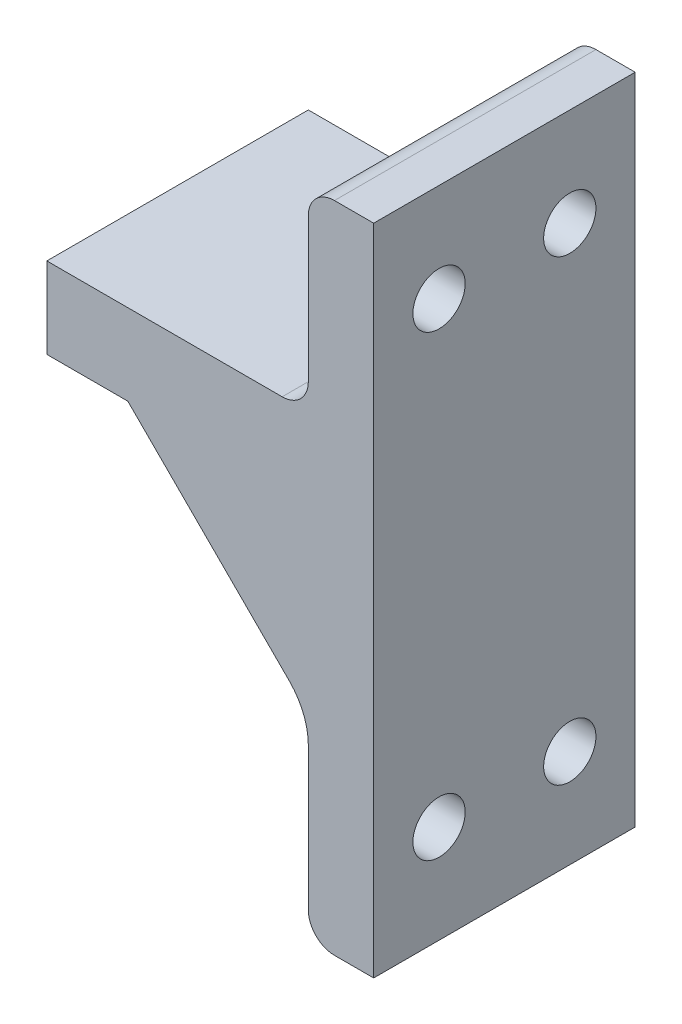
ISO-10303-21;
HEADER;
FILE_DESCRIPTION(('STEP AP214'),'2;1');
FILE_NAME('part.step','',(''),(''),'','','');
FILE_SCHEMA(('AUTOMOTIVE_DESIGN { 1 0 10303 214 1 1 1 1 }'));
ENDSEC;
DATA;
#1=APPLICATION_CONTEXT('core data for automotive mechanical design processes');
#2=APPLICATION_PROTOCOL_DEFINITION('international standard','automotive_design',2000,#1);
#3=PRODUCT_CONTEXT('',#1,'mechanical');
#4=PRODUCT('Part','Part','',(#3));
#5=PRODUCT_RELATED_PRODUCT_CATEGORY('part','',(#4));
#6=PRODUCT_DEFINITION_FORMATION('','',#4);
#7=PRODUCT_DEFINITION_CONTEXT('part definition',#1,'design');
#8=PRODUCT_DEFINITION('design','',#6,#7);
#9=PRODUCT_DEFINITION_SHAPE('','',#8);
#10=(LENGTH_UNIT() NAMED_UNIT(*) SI_UNIT(.MILLI.,.METRE.));
#11=(NAMED_UNIT(*) PLANE_ANGLE_UNIT() SI_UNIT($,.RADIAN.));
#12=(NAMED_UNIT(*) SI_UNIT($,.STERADIAN.) SOLID_ANGLE_UNIT());
#13=UNCERTAINTY_MEASURE_WITH_UNIT(LENGTH_MEASURE(1.E-05),#10,'distance_accuracy_value','');
#14=(GEOMETRIC_REPRESENTATION_CONTEXT(3) GLOBAL_UNCERTAINTY_ASSIGNED_CONTEXT((#13)) GLOBAL_UNIT_ASSIGNED_CONTEXT((#10,
#11,#12)) REPRESENTATION_CONTEXT('',''));
#15=CARTESIAN_POINT('',(0.,0.,0.));
#16=DIRECTION('',(0.,0.,1.));
#17=DIRECTION('',(1.,0.,0.));
#18=AXIS2_PLACEMENT_3D('',#15,#16,#17);
#19=CARTESIAN_POINT('',(-4.99999999999999,0.,20.));
#20=DIRECTION('',(0.,1.,0.));
#21=DIRECTION('',(-1.,0.,0.));
#22=AXIS2_PLACEMENT_3D('',#19,#20,#21);
#23=PLANE('',#22);
#24=DIRECTION('',(1.,0.,0.));
#25=VECTOR('',#24,1.);
#26=CARTESIAN_POINT('',(-4.99999999999999,0.,20.));
#27=LINE('',#26,#25);
#28=CARTESIAN_POINT('',(-2.99999999999999,0.,20.));
#29=VERTEX_POINT('',#28);
#30=CARTESIAN_POINT('',(0.,0.,20.));
#31=VERTEX_POINT('',#30);
#32=EDGE_CURVE('E178',#29,#31,#27,.T.);
#33=ORIENTED_EDGE('',*,*,#32,.F.);
#34=DIRECTION('',(0.,0.,-1.));
#35=VECTOR('',#34,1.);
#36=CARTESIAN_POINT('',(-2.99999999999999,0.,20.));
#37=LINE('',#36,#35);
#38=CARTESIAN_POINT('',(-2.99999999999999,0.,0.));
#39=VERTEX_POINT('',#38);
#40=EDGE_CURVE('E215',#29,#39,#37,.T.);
#41=ORIENTED_EDGE('',*,*,#40,.T.);
#42=DIRECTION('',(1.,0.,0.));
#43=VECTOR('',#42,1.);
#44=CARTESIAN_POINT('',(-4.99999999999999,0.,0.));
#45=LINE('',#44,#43);
#46=CARTESIAN_POINT('',(0.,0.,0.));
#47=VERTEX_POINT('',#46);
#48=EDGE_CURVE('E177',#39,#47,#45,.T.);
#49=ORIENTED_EDGE('',*,*,#48,.T.);
#50=DIRECTION('',(0.,0.,-1.));
#51=VECTOR('',#50,1.);
#52=CARTESIAN_POINT('',(0.,0.,20.));
#53=LINE('',#52,#51);
#54=EDGE_CURVE('E212',#31,#47,#53,.T.);
#55=ORIENTED_EDGE('',*,*,#54,.F.);
#56=EDGE_LOOP('',(#33,#41,#49,#55));
#57=FACE_BOUND('',#56,.T.);
#58=ADVANCED_FACE('F34',(#57),#23,.F.);
#59=CARTESIAN_POINT('',(0.,0.,20.));
#60=DIRECTION('',(-1.,0.,0.));
#61=DIRECTION('',(0.,-1.,0.));
#62=AXIS2_PLACEMENT_3D('',#59,#60,#61);
#63=PLANE('',#62);
#64=CARTESIAN_POINT('',(0.,42.4999999999999,15.));
#65=DIRECTION('',(-1.,0.,0.));
#66=DIRECTION('',(0.,-1.,0.));
#67=AXIS2_PLACEMENT_3D('',#64,#65,#66);
#68=CIRCLE('',#67,2.00000000000001);
#69=CARTESIAN_POINT('',(0.,40.4999999999999,15.));
#70=VERTEX_POINT('',#69);
#71=EDGE_CURVE('E174',#70,#70,#68,.T.);
#72=ORIENTED_EDGE('',*,*,#71,.T.);
#73=EDGE_LOOP('',(#72));
#74=FACE_BOUND('',#73,.T.);
#75=CARTESIAN_POINT('',(0.,7.5,5.00000000000001));
#76=DIRECTION('',(-1.,0.,0.));
#77=DIRECTION('',(0.,-1.,0.));
#78=AXIS2_PLACEMENT_3D('',#75,#76,#77);
#79=CIRCLE('',#78,2.);
#80=CARTESIAN_POINT('',(0.,5.5,5.00000000000001));
#81=VERTEX_POINT('',#80);
#82=EDGE_CURVE('E168',#81,#81,#79,.T.);
#83=ORIENTED_EDGE('',*,*,#82,.T.);
#84=EDGE_LOOP('',(#83));
#85=FACE_BOUND('',#84,.T.);
#86=CARTESIAN_POINT('',(0.,7.5,15.));
#87=DIRECTION('',(-1.,0.,0.));
#88=DIRECTION('',(0.,-1.,0.));
#89=AXIS2_PLACEMENT_3D('',#86,#87,#88);
#90=CIRCLE('',#89,2.);
#91=CARTESIAN_POINT('',(0.,5.5,15.));
#92=VERTEX_POINT('',#91);
#93=EDGE_CURVE('E165',#92,#92,#90,.T.);
#94=ORIENTED_EDGE('',*,*,#93,.T.);
#95=EDGE_LOOP('',(#94));
#96=FACE_BOUND('',#95,.T.);
#97=CARTESIAN_POINT('',(0.,42.4999999999999,5.));
#98=DIRECTION('',(-1.,0.,0.));
#99=DIRECTION('',(0.,-1.,0.));
#100=AXIS2_PLACEMENT_3D('',#97,#98,#99);
#101=CIRCLE('',#100,2.);
#102=CARTESIAN_POINT('',(0.,40.4999999999999,5.));
#103=VERTEX_POINT('',#102);
#104=EDGE_CURVE('E171',#103,#103,#101,.T.);
#105=ORIENTED_EDGE('',*,*,#104,.T.);
#106=EDGE_LOOP('',(#105));
#107=FACE_BOUND('',#106,.T.);
#108=DIRECTION('',(0.,1.,0.));
#109=VECTOR('',#108,1.);
#110=CARTESIAN_POINT('',(0.,0.,0.));
#111=LINE('',#110,#109);
#112=CARTESIAN_POINT('',(0.,49.9999999999999,0.));
#113=VERTEX_POINT('',#112);
#114=EDGE_CURVE('E195',#47,#113,#111,.T.);
#115=ORIENTED_EDGE('',*,*,#114,.T.);
#116=DIRECTION('',(0.,0.,-1.));
#117=VECTOR('',#116,1.);
#118=CARTESIAN_POINT('',(0.,49.9999999999999,20.));
#119=LINE('',#118,#117);
#120=CARTESIAN_POINT('',(0.,49.9999999999999,20.));
#121=VERTEX_POINT('',#120);
#122=EDGE_CURVE('E209',#121,#113,#119,.T.);
#123=ORIENTED_EDGE('',*,*,#122,.F.);
#124=DIRECTION('',(0.,1.,0.));
#125=VECTOR('',#124,1.);
#126=CARTESIAN_POINT('',(0.,0.,20.));
#127=LINE('',#126,#125);
#128=EDGE_CURVE('E180',#31,#121,#127,.T.);
#129=ORIENTED_EDGE('',*,*,#128,.F.);
#130=ORIENTED_EDGE('',*,*,#54,.T.);
#131=EDGE_LOOP('',(#115,#123,#129,#130));
#132=FACE_BOUND('',#131,.T.);
#133=ADVANCED_FACE('F282',(#74,#85,#96,#107,#132),#63,.F.);
#134=CARTESIAN_POINT('',(0.,49.9999999999999,20.));
#135=DIRECTION('',(0.,-1.,0.));
#136=DIRECTION('',(1.,0.,0.));
#137=AXIS2_PLACEMENT_3D('',#134,#135,#136);
#138=PLANE('',#137);
#139=DIRECTION('',(-1.,0.,0.));
#140=VECTOR('',#139,1.);
#141=CARTESIAN_POINT('',(0.,49.9999999999999,0.));
#142=LINE('',#141,#140);
#143=CARTESIAN_POINT('',(-3.,49.9999999999999,0.));
#144=VERTEX_POINT('',#143);
#145=EDGE_CURVE('E197',#113,#144,#142,.T.);
#146=ORIENTED_EDGE('',*,*,#145,.T.);
#147=DIRECTION('',(0.,0.,-1.));
#148=VECTOR('',#147,1.);
#149=CARTESIAN_POINT('',(-3.,49.9999999999999,20.));
#150=LINE('',#149,#148);
#151=CARTESIAN_POINT('',(-3.,49.9999999999999,20.));
#152=VERTEX_POINT('',#151);
#153=EDGE_CURVE('E235',#144,#152,#150,.F.);
#154=ORIENTED_EDGE('',*,*,#153,.T.);
#155=DIRECTION('',(-1.,0.,0.));
#156=VECTOR('',#155,1.);
#157=CARTESIAN_POINT('',(0.,49.9999999999999,20.));
#158=LINE('',#157,#156);
#159=EDGE_CURVE('E183',#121,#152,#158,.T.);
#160=ORIENTED_EDGE('',*,*,#159,.F.);
#161=ORIENTED_EDGE('',*,*,#122,.T.);
#162=EDGE_LOOP('',(#146,#154,#160,#161));
#163=FACE_BOUND('',#162,.T.);
#164=ADVANCED_FACE('F278',(#163),#138,.F.);
#165=CARTESIAN_POINT('',(-5.00000000000001,49.9999999999999,20.));
#166=DIRECTION('',(1.,0.,0.));
#167=DIRECTION('',(0.,1.,0.));
#168=AXIS2_PLACEMENT_3D('',#165,#166,#167);
#169=PLANE('',#168);
#170=CARTESIAN_POINT('',(-5.00000000000001,42.4999999999999,15.));
#171=DIRECTION('',(-1.,0.,0.));
#172=DIRECTION('',(0.,-1.,0.));
#173=AXIS2_PLACEMENT_3D('',#170,#171,#172);
#174=CIRCLE('',#173,2.00000000000001);
#175=CARTESIAN_POINT('',(-5.,40.4999999999999,15.));
#176=VERTEX_POINT('',#175);
#177=EDGE_CURVE('E157',#176,#176,#174,.T.);
#178=ORIENTED_EDGE('',*,*,#177,.F.);
#179=EDGE_LOOP('',(#178));
#180=FACE_BOUND('',#179,.T.);
#181=CARTESIAN_POINT('',(-5.00000000000001,42.4999999999999,5.));
#182=DIRECTION('',(-1.,0.,0.));
#183=DIRECTION('',(0.,-1.,0.));
#184=AXIS2_PLACEMENT_3D('',#181,#182,#183);
#185=CIRCLE('',#184,2.);
#186=CARTESIAN_POINT('',(-5.,40.4999999999999,5.));
#187=VERTEX_POINT('',#186);
#188=EDGE_CURVE('E160',#187,#187,#185,.T.);
#189=ORIENTED_EDGE('',*,*,#188,.F.);
#190=EDGE_LOOP('',(#189));
#191=FACE_BOUND('',#190,.T.);
#192=DIRECTION('',(0.,-1.,0.));
#193=VECTOR('',#192,1.);
#194=CARTESIAN_POINT('',(-5.00000000000001,49.9999999999999,20.));
#195=LINE('',#194,#193);
#196=CARTESIAN_POINT('',(-5.,47.9999999999999,20.));
#197=VERTEX_POINT('',#196);
#198=CARTESIAN_POINT('',(-5.,36.9999999999999,20.));
#199=VERTEX_POINT('',#198);
#200=EDGE_CURVE('E186',#197,#199,#195,.T.);
#201=ORIENTED_EDGE('',*,*,#200,.F.);
#202=DIRECTION('',(0.,0.,-1.));
#203=VECTOR('',#202,1.);
#204=CARTESIAN_POINT('',(-5.,47.9999999999999,20.));
#205=LINE('',#204,#203);
#206=CARTESIAN_POINT('',(-5.,47.9999999999999,0.));
#207=VERTEX_POINT('',#206);
#208=EDGE_CURVE('E232',#197,#207,#205,.T.);
#209=ORIENTED_EDGE('',*,*,#208,.T.);
#210=DIRECTION('',(0.,-1.,0.));
#211=VECTOR('',#210,1.);
#212=CARTESIAN_POINT('',(-5.00000000000001,49.9999999999999,0.));
#213=LINE('',#212,#211);
#214=CARTESIAN_POINT('',(-5.,36.9999999999999,0.));
#215=VERTEX_POINT('',#214);
#216=EDGE_CURVE('E200',#207,#215,#213,.T.);
#217=ORIENTED_EDGE('',*,*,#216,.T.);
#218=DIRECTION('',(0.,0.,-1.));
#219=VECTOR('',#218,1.);
#220=CARTESIAN_POINT('',(-5.,36.9999999999999,20.));
#221=LINE('',#220,#219);
#222=EDGE_CURVE('E230',#215,#199,#221,.F.);
#223=ORIENTED_EDGE('',*,*,#222,.T.);
#224=EDGE_LOOP('',(#201,#209,#217,#223));
#225=FACE_BOUND('',#224,.T.);
#226=ADVANCED_FACE('F268',(#180,#191,#225),#169,.F.);
#227=CARTESIAN_POINT('',(-5.,34.9999999999999,20.));
#228=DIRECTION('',(0.,-1.,0.));
#229=DIRECTION('',(1.,0.,0.));
#230=AXIS2_PLACEMENT_3D('',#227,#228,#229);
#231=PLANE('',#230);
#232=DIRECTION('',(-1.,0.,0.));
#233=VECTOR('',#232,1.);
#234=CARTESIAN_POINT('',(-5.,34.9999999999999,0.));
#235=LINE('',#234,#233);
#236=CARTESIAN_POINT('',(-7.,34.9999999999999,0.));
#237=VERTEX_POINT('',#236);
#238=CARTESIAN_POINT('',(-25.,34.9999999999999,0.));
#239=VERTEX_POINT('',#238);
#240=EDGE_CURVE('E203',#237,#239,#235,.T.);
#241=ORIENTED_EDGE('',*,*,#240,.T.);
#242=DIRECTION('',(0.,0.,-1.));
#243=VECTOR('',#242,1.);
#244=CARTESIAN_POINT('',(-25.,34.9999999999999,20.));
#245=LINE('',#244,#243);
#246=CARTESIAN_POINT('',(-25.,34.9999999999999,20.));
#247=VERTEX_POINT('',#246);
#248=EDGE_CURVE('E193',#247,#239,#245,.T.);
#249=ORIENTED_EDGE('',*,*,#248,.F.);
#250=DIRECTION('',(-1.,0.,0.));
#251=VECTOR('',#250,1.);
#252=CARTESIAN_POINT('',(-5.,34.9999999999999,20.));
#253=LINE('',#252,#251);
#254=CARTESIAN_POINT('',(-7.,34.9999999999999,20.));
#255=VERTEX_POINT('',#254);
#256=EDGE_CURVE('E144',#255,#247,#253,.T.);
#257=ORIENTED_EDGE('',*,*,#256,.F.);
#258=DIRECTION('',(0.,0.,-1.));
#259=VECTOR('',#258,1.);
#260=CARTESIAN_POINT('',(-7.,34.9999999999999,0.));
#261=LINE('',#260,#259);
#262=EDGE_CURVE('E237',#255,#237,#261,.T.);
#263=ORIENTED_EDGE('',*,*,#262,.T.);
#264=EDGE_LOOP('',(#241,#249,#257,#263));
#265=FACE_BOUND('',#264,.T.);
#266=ADVANCED_FACE('F260',(#265),#231,.F.);
#267=CARTESIAN_POINT('',(-25.,34.9999999999999,20.));
#268=DIRECTION('',(0.707106781186546,0.707106781186549,0.));
#269=DIRECTION('',(-0.707106781186549,0.707106781186546,0.));
#270=AXIS2_PLACEMENT_3D('',#267,#268,#269);
#271=PLANE('',#270);
#272=DIRECTION('',(0.707106781186549,-0.707106781186546,0.));
#273=VECTOR('',#272,1.);
#274=CARTESIAN_POINT('',(-25.,34.9999999999999,20.));
#275=LINE('',#274,#273);
#276=CARTESIAN_POINT('',(-18.8057883271399,28.8057883271398,20.));
#277=VERTEX_POINT('',#276);
#278=CARTESIAN_POINT('',(-6.46446609406726,16.4644660940673,20.));
#279=VERTEX_POINT('',#278);
#280=EDGE_CURVE('E49',#277,#279,#275,.T.);
#281=ORIENTED_EDGE('',*,*,#280,.F.);
#282=DIRECTION('',(0.,0.,-1.));
#283=VECTOR('',#282,1.);
#284=CARTESIAN_POINT('',(-18.8057883271399,28.8057883271398,20.));
#285=LINE('',#284,#283);
#286=CARTESIAN_POINT('',(-18.8057883271399,28.8057883271398,0.));
#287=VERTEX_POINT('',#286);
#288=EDGE_CURVE('E139',#277,#287,#285,.T.);
#289=ORIENTED_EDGE('',*,*,#288,.T.);
#290=DIRECTION('',(0.707106781186549,-0.707106781186546,0.));
#291=VECTOR('',#290,1.);
#292=CARTESIAN_POINT('',(-25.,34.9999999999999,0.));
#293=LINE('',#292,#291);
#294=CARTESIAN_POINT('',(-6.46446609406726,16.4644660940673,0.));
#295=VERTEX_POINT('',#294);
#296=EDGE_CURVE('E205',#287,#295,#293,.T.);
#297=ORIENTED_EDGE('',*,*,#296,.T.);
#298=DIRECTION('',(0.,0.,-1.));
#299=VECTOR('',#298,1.);
#300=CARTESIAN_POINT('',(-6.46446609406727,16.4644660940673,20.));
#301=LINE('',#300,#299);
#302=EDGE_CURVE('E247',#295,#279,#301,.F.);
#303=ORIENTED_EDGE('',*,*,#302,.T.);
#304=EDGE_LOOP('',(#281,#289,#297,#303));
#305=FACE_BOUND('',#304,.T.);
#306=ADVANCED_FACE('F256',(#305),#271,.F.);
#307=CARTESIAN_POINT('',(-5.,15.,20.));
#308=DIRECTION('',(1.,0.,0.));
#309=DIRECTION('',(0.,1.,0.));
#310=AXIS2_PLACEMENT_3D('',#307,#308,#309);
#311=PLANE('',#310);
#312=CARTESIAN_POINT('',(-4.99999999999999,7.5,5.00000000000001));
#313=DIRECTION('',(-1.,0.,0.));
#314=DIRECTION('',(0.,-1.,0.));
#315=AXIS2_PLACEMENT_3D('',#312,#313,#314);
#316=CIRCLE('',#315,2.);
#317=CARTESIAN_POINT('',(-4.99999999999999,5.5,5.00000000000001));
#318=VERTEX_POINT('',#317);
#319=EDGE_CURVE('E156',#318,#318,#316,.T.);
#320=ORIENTED_EDGE('',*,*,#319,.F.);
#321=EDGE_LOOP('',(#320));
#322=FACE_BOUND('',#321,.T.);
#323=CARTESIAN_POINT('',(-4.99999999999999,7.5,15.));
#324=DIRECTION('',(-1.,0.,0.));
#325=DIRECTION('',(0.,-1.,0.));
#326=AXIS2_PLACEMENT_3D('',#323,#324,#325);
#327=CIRCLE('',#326,2.);
#328=CARTESIAN_POINT('',(-4.99999999999999,5.5,15.));
#329=VERTEX_POINT('',#328);
#330=EDGE_CURVE('E138',#329,#329,#327,.T.);
#331=ORIENTED_EDGE('',*,*,#330,.F.);
#332=EDGE_LOOP('',(#331));
#333=FACE_BOUND('',#332,.T.);
#334=DIRECTION('',(0.,-1.,0.));
#335=VECTOR('',#334,1.);
#336=CARTESIAN_POINT('',(-5.,15.,20.));
#337=LINE('',#336,#335);
#338=CARTESIAN_POINT('',(-5.,12.9289321881345,20.));
#339=VERTEX_POINT('',#338);
#340=CARTESIAN_POINT('',(-4.99999999999999,2.,20.));
#341=VERTEX_POINT('',#340);
#342=EDGE_CURVE('E191',#339,#341,#337,.T.);
#343=ORIENTED_EDGE('',*,*,#342,.F.);
#344=DIRECTION('',(0.,0.,-1.));
#345=VECTOR('',#344,1.);
#346=CARTESIAN_POINT('',(-5.,12.9289321881345,0.));
#347=LINE('',#346,#345);
#348=CARTESIAN_POINT('',(-5.,12.9289321881345,0.));
#349=VERTEX_POINT('',#348);
#350=EDGE_CURVE('E244',#339,#349,#347,.T.);
#351=ORIENTED_EDGE('',*,*,#350,.T.);
#352=DIRECTION('',(0.,-1.,0.));
#353=VECTOR('',#352,1.);
#354=CARTESIAN_POINT('',(-5.,15.,0.));
#355=LINE('',#354,#353);
#356=CARTESIAN_POINT('',(-4.99999999999999,2.,0.));
#357=VERTEX_POINT('',#356);
#358=EDGE_CURVE('E181',#349,#357,#355,.T.);
#359=ORIENTED_EDGE('',*,*,#358,.T.);
#360=DIRECTION('',(0.,0.,-1.));
#361=VECTOR('',#360,1.);
#362=CARTESIAN_POINT('',(-4.99999999999999,2.,20.));
#363=LINE('',#362,#361);
#364=EDGE_CURVE('E223',#357,#341,#363,.F.);
#365=ORIENTED_EDGE('',*,*,#364,.T.);
#366=EDGE_LOOP('',(#343,#351,#359,#365));
#367=FACE_BOUND('',#366,.T.);
#368=ADVANCED_FACE('F294',(#322,#333,#367),#311,.F.);
#369=CARTESIAN_POINT('',(0.,0.,20.));
#370=DIRECTION('',(0.,0.,1.));
#371=DIRECTION('',(1.,0.,0.));
#372=AXIS2_PLACEMENT_3D('',#369,#370,#371);
#373=PLANE('',#372);
#374=ORIENTED_EDGE('',*,*,#256,.T.);
#375=DIRECTION('',(0.,1.,0.));
#376=VECTOR('',#375,1.);
#377=CARTESIAN_POINT('',(-25.,34.9999999999999,20.));
#378=LINE('',#377,#376);
#379=CARTESIAN_POINT('',(-25.,28.8057883271398,20.));
#380=VERTEX_POINT('',#379);
#381=EDGE_CURVE('E131',#380,#247,#378,.T.);
#382=ORIENTED_EDGE('',*,*,#381,.F.);
#383=DIRECTION('',(-1.,0.,0.));
#384=VECTOR('',#383,1.);
#385=CARTESIAN_POINT('',(-18.8057883271399,28.8057883271398,20.));
#386=LINE('',#385,#384);
#387=EDGE_CURVE('E142',#277,#380,#386,.T.);
#388=ORIENTED_EDGE('',*,*,#387,.F.);
#389=ORIENTED_EDGE('',*,*,#280,.T.);
#390=CARTESIAN_POINT('',(-10.,12.9289321881345,20.));
#391=DIRECTION('',(0.,0.,1.));
#392=DIRECTION('',(1.,0.,0.));
#393=AXIS2_PLACEMENT_3D('',#390,#391,#392);
#394=CIRCLE('',#393,5.);
#395=EDGE_CURVE('E11',#279,#339,#394,.F.);
#396=ORIENTED_EDGE('',*,*,#395,.T.);
#397=ORIENTED_EDGE('',*,*,#342,.T.);
#398=CARTESIAN_POINT('',(-2.99999999999999,2.,20.));
#399=DIRECTION('',(0.,0.,1.));
#400=DIRECTION('',(1.,0.,0.));
#401=AXIS2_PLACEMENT_3D('',#398,#399,#400);
#402=CIRCLE('',#401,2.);
#403=EDGE_CURVE('E228',#341,#29,#402,.T.);
#404=ORIENTED_EDGE('',*,*,#403,.T.);
#405=ORIENTED_EDGE('',*,*,#32,.T.);
#406=ORIENTED_EDGE('',*,*,#128,.T.);
#407=ORIENTED_EDGE('',*,*,#159,.T.);
#408=CARTESIAN_POINT('',(-3.,47.9999999999999,20.));
#409=DIRECTION('',(0.,0.,1.));
#410=DIRECTION('',(1.,0.,0.));
#411=AXIS2_PLACEMENT_3D('',#408,#409,#410);
#412=CIRCLE('',#411,2.);
#413=EDGE_CURVE('E226',#152,#197,#412,.T.);
#414=ORIENTED_EDGE('',*,*,#413,.T.);
#415=ORIENTED_EDGE('',*,*,#200,.T.);
#416=CARTESIAN_POINT('',(-7.,36.9999999999999,20.));
#417=DIRECTION('',(0.,0.,1.));
#418=DIRECTION('',(1.,0.,0.));
#419=AXIS2_PLACEMENT_3D('',#416,#417,#418);
#420=CIRCLE('',#419,2.);
#421=EDGE_CURVE('E242',#199,#255,#420,.F.);
#422=ORIENTED_EDGE('',*,*,#421,.T.);
#423=EDGE_LOOP('',(#374,#382,#388,#389,#396,#397,#404,#405,#406,#407,#414,#415,#422));
#424=FACE_BOUND('',#423,.T.);
#425=ADVANCED_FACE('F141',(#424),#373,.T.);
#426=CARTESIAN_POINT('',(0.,0.,0.));
#427=DIRECTION('',(0.,0.,1.));
#428=DIRECTION('',(1.,0.,0.));
#429=AXIS2_PLACEMENT_3D('',#426,#427,#428);
#430=PLANE('',#429);
#431=ORIENTED_EDGE('',*,*,#296,.F.);
#432=DIRECTION('',(-1.,0.,0.));
#433=VECTOR('',#432,1.);
#434=CARTESIAN_POINT('',(-18.8057883271399,28.8057883271398,0.));
#435=LINE('',#434,#433);
#436=CARTESIAN_POINT('',(-25.,28.8057883271398,0.));
#437=VERTEX_POINT('',#436);
#438=EDGE_CURVE('E149',#287,#437,#435,.T.);
#439=ORIENTED_EDGE('',*,*,#438,.T.);
#440=DIRECTION('',(0.,1.,0.));
#441=VECTOR('',#440,1.);
#442=CARTESIAN_POINT('',(-25.,34.9999999999999,0.));
#443=LINE('',#442,#441);
#444=EDGE_CURVE('E133',#437,#239,#443,.T.);
#445=ORIENTED_EDGE('',*,*,#444,.T.);
#446=ORIENTED_EDGE('',*,*,#240,.F.);
#447=CARTESIAN_POINT('',(-7.,36.9999999999999,0.));
#448=DIRECTION('',(0.,0.,1.));
#449=DIRECTION('',(1.,0.,0.));
#450=AXIS2_PLACEMENT_3D('',#447,#448,#449);
#451=CIRCLE('',#450,2.);
#452=EDGE_CURVE('E240',#237,#215,#451,.T.);
#453=ORIENTED_EDGE('',*,*,#452,.T.);
#454=ORIENTED_EDGE('',*,*,#216,.F.);
#455=CARTESIAN_POINT('',(-3.,47.9999999999999,0.));
#456=DIRECTION('',(0.,0.,1.));
#457=DIRECTION('',(1.,0.,0.));
#458=AXIS2_PLACEMENT_3D('',#455,#456,#457);
#459=CIRCLE('',#458,2.);
#460=EDGE_CURVE('E218',#207,#144,#459,.F.);
#461=ORIENTED_EDGE('',*,*,#460,.T.);
#462=ORIENTED_EDGE('',*,*,#145,.F.);
#463=ORIENTED_EDGE('',*,*,#114,.F.);
#464=ORIENTED_EDGE('',*,*,#48,.F.);
#465=CARTESIAN_POINT('',(-2.99999999999999,2.,0.));
#466=DIRECTION('',(0.,0.,1.));
#467=DIRECTION('',(1.,0.,0.));
#468=AXIS2_PLACEMENT_3D('',#465,#466,#467);
#469=CIRCLE('',#468,2.);
#470=EDGE_CURVE('E220',#39,#357,#469,.F.);
#471=ORIENTED_EDGE('',*,*,#470,.T.);
#472=ORIENTED_EDGE('',*,*,#358,.F.);
#473=CARTESIAN_POINT('',(-10.,12.9289321881345,0.));
#474=DIRECTION('',(0.,0.,1.));
#475=DIRECTION('',(1.,0.,0.));
#476=AXIS2_PLACEMENT_3D('',#473,#474,#475);
#477=CIRCLE('',#476,5.);
#478=EDGE_CURVE('E42',#349,#295,#477,.T.);
#479=ORIENTED_EDGE('',*,*,#478,.T.);
#480=EDGE_LOOP('',(#431,#439,#445,#446,#453,#454,#461,#462,#463,#464,#471,#472,#479));
#481=FACE_BOUND('',#480,.T.);
#482=ADVANCED_FACE('F252',(#481),#430,.F.);
#483=CARTESIAN_POINT('',(15.,7.50000000000001,15.));
#484=DIRECTION('',(-1.,0.,0.));
#485=DIRECTION('',(0.,-1.,0.));
#486=AXIS2_PLACEMENT_3D('',#483,#484,#485);
#487=CYLINDRICAL_SURFACE('',#486,2.);
#488=ORIENTED_EDGE('',*,*,#330,.T.);
#489=EDGE_LOOP('',(#488));
#490=FACE_BOUND('',#489,.T.);
#491=ORIENTED_EDGE('',*,*,#93,.F.);
#492=EDGE_LOOP('',(#491));
#493=FACE_BOUND('',#492,.T.);
#494=ADVANCED_FACE('F333',(#490,#493),#487,.F.);
#495=CARTESIAN_POINT('',(15.,7.50000000000001,5.00000000000001));
#496=DIRECTION('',(-1.,0.,0.));
#497=DIRECTION('',(0.,-1.,0.));
#498=AXIS2_PLACEMENT_3D('',#495,#496,#497);
#499=CYLINDRICAL_SURFACE('',#498,2.);
#500=ORIENTED_EDGE('',*,*,#319,.T.);
#501=EDGE_LOOP('',(#500));
#502=FACE_BOUND('',#501,.T.);
#503=ORIENTED_EDGE('',*,*,#82,.F.);
#504=EDGE_LOOP('',(#503));
#505=FACE_BOUND('',#504,.T.);
#506=ADVANCED_FACE('F336',(#502,#505),#499,.F.);
#507=CARTESIAN_POINT('',(15.,42.4999999999999,5.));
#508=DIRECTION('',(-1.,0.,0.));
#509=DIRECTION('',(0.,-1.,0.));
#510=AXIS2_PLACEMENT_3D('',#507,#508,#509);
#511=CYLINDRICAL_SURFACE('',#510,2.);
#512=ORIENTED_EDGE('',*,*,#188,.T.);
#513=EDGE_LOOP('',(#512));
#514=FACE_BOUND('',#513,.T.);
#515=ORIENTED_EDGE('',*,*,#104,.F.);
#516=EDGE_LOOP('',(#515));
#517=FACE_BOUND('',#516,.T.);
#518=ADVANCED_FACE('F340',(#514,#517),#511,.F.);
#519=CARTESIAN_POINT('',(15.,42.4999999999999,15.));
#520=DIRECTION('',(-1.,0.,0.));
#521=DIRECTION('',(0.,-1.,0.));
#522=AXIS2_PLACEMENT_3D('',#519,#520,#521);
#523=CYLINDRICAL_SURFACE('',#522,2.00000000000001);
#524=ORIENTED_EDGE('',*,*,#177,.T.);
#525=EDGE_LOOP('',(#524));
#526=FACE_BOUND('',#525,.T.);
#527=ORIENTED_EDGE('',*,*,#71,.F.);
#528=EDGE_LOOP('',(#527));
#529=FACE_BOUND('',#528,.T.);
#530=ADVANCED_FACE('F318',(#526,#529),#523,.F.);
#531=CARTESIAN_POINT('',(-2.99999999999999,2.,20.));
#532=DIRECTION('',(0.,0.,-1.));
#533=DIRECTION('',(-1.,0.,0.));
#534=AXIS2_PLACEMENT_3D('',#531,#532,#533);
#535=CYLINDRICAL_SURFACE('',#534,2.);
#536=ORIENTED_EDGE('',*,*,#403,.F.);
#537=ORIENTED_EDGE('',*,*,#364,.F.);
#538=ORIENTED_EDGE('',*,*,#470,.F.);
#539=ORIENTED_EDGE('',*,*,#40,.F.);
#540=EDGE_LOOP('',(#536,#537,#538,#539));
#541=FACE_BOUND('',#540,.T.);
#542=ADVANCED_FACE('F291',(#541),#535,.T.);
#543=CARTESIAN_POINT('',(-3.,47.9999999999999,20.));
#544=DIRECTION('',(0.,0.,-1.));
#545=DIRECTION('',(-1.,0.,0.));
#546=AXIS2_PLACEMENT_3D('',#543,#544,#545);
#547=CYLINDRICAL_SURFACE('',#546,2.);
#548=ORIENTED_EDGE('',*,*,#413,.F.);
#549=ORIENTED_EDGE('',*,*,#153,.F.);
#550=ORIENTED_EDGE('',*,*,#460,.F.);
#551=ORIENTED_EDGE('',*,*,#208,.F.);
#552=EDGE_LOOP('',(#548,#549,#550,#551));
#553=FACE_BOUND('',#552,.T.);
#554=ADVANCED_FACE('F274',(#553),#547,.T.);
#555=CARTESIAN_POINT('',(-7.,36.9999999999999,20.));
#556=DIRECTION('',(0.,0.,1.));
#557=DIRECTION('',(1.,0.,0.));
#558=AXIS2_PLACEMENT_3D('',#555,#556,#557);
#559=CYLINDRICAL_SURFACE('',#558,2.);
#560=ORIENTED_EDGE('',*,*,#421,.F.);
#561=ORIENTED_EDGE('',*,*,#222,.F.);
#562=ORIENTED_EDGE('',*,*,#452,.F.);
#563=ORIENTED_EDGE('',*,*,#262,.F.);
#564=EDGE_LOOP('',(#560,#561,#562,#563));
#565=FACE_BOUND('',#564,.T.);
#566=ADVANCED_FACE('F264',(#565),#559,.F.);
#567=CARTESIAN_POINT('',(-10.,12.9289321881345,20.));
#568=DIRECTION('',(0.,0.,1.));
#569=DIRECTION('',(1.,0.,0.));
#570=AXIS2_PLACEMENT_3D('',#567,#568,#569);
#571=CYLINDRICAL_SURFACE('',#570,5.);
#572=ORIENTED_EDGE('',*,*,#395,.F.);
#573=ORIENTED_EDGE('',*,*,#302,.F.);
#574=ORIENTED_EDGE('',*,*,#478,.F.);
#575=ORIENTED_EDGE('',*,*,#350,.F.);
#576=EDGE_LOOP('',(#572,#573,#574,#575));
#577=FACE_BOUND('',#576,.T.);
#578=ADVANCED_FACE('F36',(#577),#571,.F.);
#579=CARTESIAN_POINT('',(-25.,34.9999999999999,20.));
#580=DIRECTION('',(-1.,0.,0.));
#581=DIRECTION('',(0.,0.,1.));
#582=AXIS2_PLACEMENT_3D('',#579,#580,#581);
#583=PLANE('',#582);
#584=ORIENTED_EDGE('',*,*,#444,.F.);
#585=DIRECTION('',(0.,0.,-1.));
#586=VECTOR('',#585,1.);
#587=CARTESIAN_POINT('',(-25.,28.8057883271398,20.));
#588=LINE('',#587,#586);
#589=EDGE_CURVE('E127',#380,#437,#588,.T.);
#590=ORIENTED_EDGE('',*,*,#589,.F.);
#591=ORIENTED_EDGE('',*,*,#381,.T.);
#592=ORIENTED_EDGE('',*,*,#248,.T.);
#593=EDGE_LOOP('',(#584,#590,#591,#592));
#594=FACE_BOUND('',#593,.T.);
#595=ADVANCED_FACE('F129',(#594),#583,.T.);
#596=CARTESIAN_POINT('',(-18.8057883271399,28.8057883271398,20.));
#597=DIRECTION('',(0.,-1.,0.));
#598=DIRECTION('',(0.,0.,-1.));
#599=AXIS2_PLACEMENT_3D('',#596,#597,#598);
#600=PLANE('',#599);
#601=ORIENTED_EDGE('',*,*,#438,.F.);
#602=ORIENTED_EDGE('',*,*,#288,.F.);
#603=ORIENTED_EDGE('',*,*,#387,.T.);
#604=ORIENTED_EDGE('',*,*,#589,.T.);
#605=EDGE_LOOP('',(#601,#602,#603,#604));
#606=FACE_BOUND('',#605,.T.);
#607=ADVANCED_FACE('F147',(#606),#600,.T.);
#608=CLOSED_SHELL('',(#58,#133,#164,#226,#266,#306,#368,#425,#482,#494,#506,#518,#530,#542,#554,
#566,#578,#595,#607));
#609=MANIFOLD_SOLID_BREP('B2',#608);
#610=ADVANCED_BREP_SHAPE_REPRESENTATION('',(#18,#609),#14);
#611=SHAPE_DEFINITION_REPRESENTATION(#9,#610);
ENDSEC;
END-ISO-10303-21;
